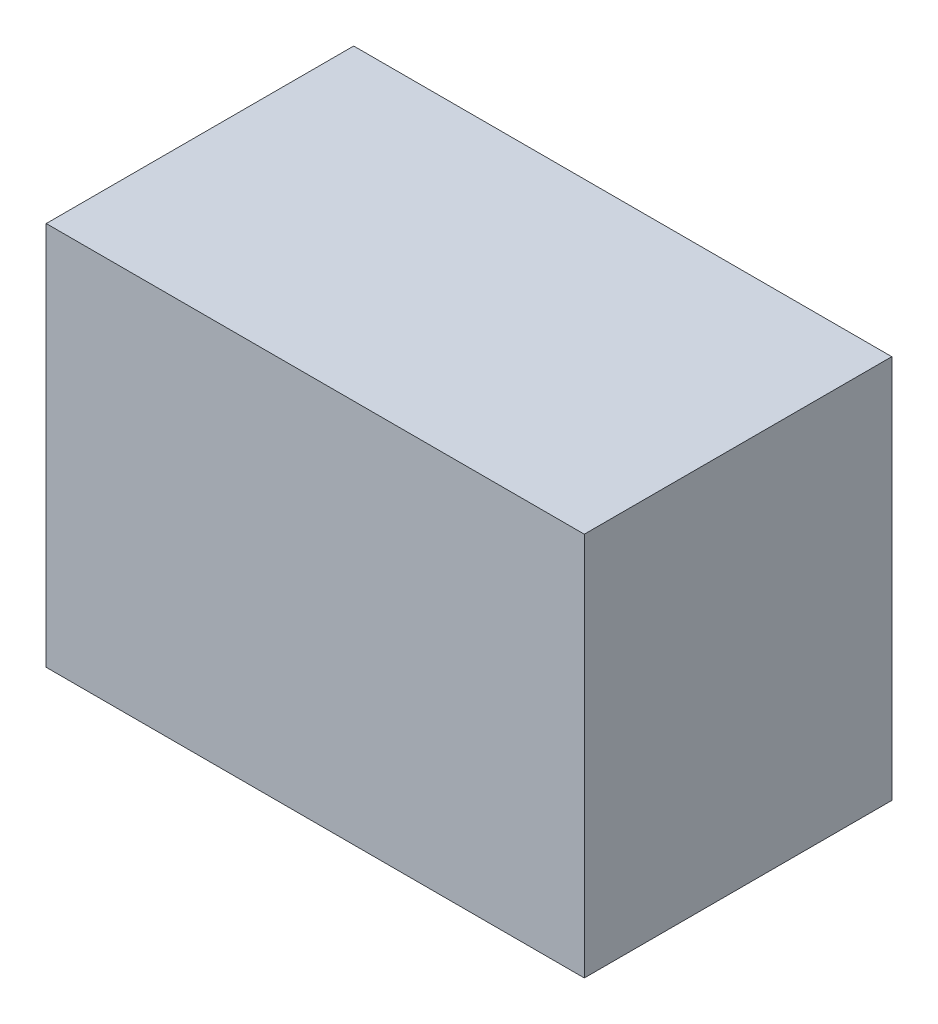
ISO-10303-21;
HEADER;
FILE_DESCRIPTION(('STEP AP214'),'2;1');
FILE_NAME('part.step','',(''),(''),'','','');
FILE_SCHEMA(('AUTOMOTIVE_DESIGN { 1 0 10303 214 1 1 1 1 }'));
ENDSEC;
DATA;
#1=APPLICATION_CONTEXT('core data for automotive mechanical design processes');
#2=APPLICATION_PROTOCOL_DEFINITION('international standard','automotive_design',2000,#1);
#3=PRODUCT_CONTEXT('',#1,'mechanical');
#4=PRODUCT('Part','Part','',(#3));
#5=PRODUCT_RELATED_PRODUCT_CATEGORY('part','',(#4));
#6=PRODUCT_DEFINITION_FORMATION('','',#4);
#7=PRODUCT_DEFINITION_CONTEXT('part definition',#1,'design');
#8=PRODUCT_DEFINITION('design','',#6,#7);
#9=PRODUCT_DEFINITION_SHAPE('','',#8);
#10=(LENGTH_UNIT() NAMED_UNIT(*) SI_UNIT(.MILLI.,.METRE.));
#11=(NAMED_UNIT(*) PLANE_ANGLE_UNIT() SI_UNIT($,.RADIAN.));
#12=(NAMED_UNIT(*) SI_UNIT($,.STERADIAN.) SOLID_ANGLE_UNIT());
#13=UNCERTAINTY_MEASURE_WITH_UNIT(LENGTH_MEASURE(1.E-05),#10,'distance_accuracy_value','');
#14=(GEOMETRIC_REPRESENTATION_CONTEXT(3) GLOBAL_UNCERTAINTY_ASSIGNED_CONTEXT((#13)) GLOBAL_UNIT_ASSIGNED_CONTEXT((#10,
#11,#12)) REPRESENTATION_CONTEXT('',''));
#15=CARTESIAN_POINT('',(0.,0.,0.));
#16=DIRECTION('',(0.,0.,1.));
#17=DIRECTION('',(1.,0.,0.));
#18=AXIS2_PLACEMENT_3D('',#15,#16,#17);
#19=CARTESIAN_POINT('',(-70.,50.,80.));
#20=DIRECTION('',(1.,0.,0.));
#21=DIRECTION('',(0.,0.,-1.));
#22=AXIS2_PLACEMENT_3D('',#19,#20,#21);
#23=PLANE('',#22);
#24=DIRECTION('',(0.,-1.,0.));
#25=VECTOR('',#24,1.);
#26=CARTESIAN_POINT('',(-70.,50.,0.));
#27=LINE('',#26,#25);
#28=CARTESIAN_POINT('',(-70.,50.,0.));
#29=VERTEX_POINT('',#28);
#30=CARTESIAN_POINT('',(-70.,-50.,0.));
#31=VERTEX_POINT('',#30);
#32=EDGE_CURVE('E82',#29,#31,#27,.T.);
#33=ORIENTED_EDGE('',*,*,#32,.T.);
#34=DIRECTION('',(0.,0.,-1.));
#35=VECTOR('',#34,1.);
#36=CARTESIAN_POINT('',(-70.,-50.,80.));
#37=LINE('',#36,#35);
#38=CARTESIAN_POINT('',(-70.,-50.,80.));
#39=VERTEX_POINT('',#38);
#40=EDGE_CURVE('E11',#39,#31,#37,.T.);
#41=ORIENTED_EDGE('',*,*,#40,.F.);
#42=DIRECTION('',(0.,-1.,0.));
#43=VECTOR('',#42,1.);
#44=CARTESIAN_POINT('',(-70.,50.,80.));
#45=LINE('',#44,#43);
#46=CARTESIAN_POINT('',(-70.,50.,80.));
#47=VERTEX_POINT('',#46);
#48=EDGE_CURVE('E68',#47,#39,#45,.T.);
#49=ORIENTED_EDGE('',*,*,#48,.F.);
#50=DIRECTION('',(0.,0.,-1.));
#51=VECTOR('',#50,1.);
#52=CARTESIAN_POINT('',(-70.,50.,80.));
#53=LINE('',#52,#51);
#54=EDGE_CURVE('E76',#47,#29,#53,.T.);
#55=ORIENTED_EDGE('',*,*,#54,.T.);
#56=EDGE_LOOP('',(#33,#41,#49,#55));
#57=FACE_BOUND('',#56,.T.);
#58=ADVANCED_FACE('F17',(#57),#23,.F.);
#59=CARTESIAN_POINT('',(-70.,-50.,80.));
#60=DIRECTION('',(0.,1.,0.));
#61=DIRECTION('',(0.,0.,1.));
#62=AXIS2_PLACEMENT_3D('',#59,#60,#61);
#63=PLANE('',#62);
#64=DIRECTION('',(1.,0.,0.));
#65=VECTOR('',#64,1.);
#66=CARTESIAN_POINT('',(-70.,-50.,0.));
#67=LINE('',#66,#65);
#68=CARTESIAN_POINT('',(70.,-50.,0.));
#69=VERTEX_POINT('',#68);
#70=EDGE_CURVE('E72',#31,#69,#67,.T.);
#71=ORIENTED_EDGE('',*,*,#70,.T.);
#72=DIRECTION('',(0.,0.,-1.));
#73=VECTOR('',#72,1.);
#74=CARTESIAN_POINT('',(70.,-50.,80.));
#75=LINE('',#74,#73);
#76=CARTESIAN_POINT('',(70.,-50.,80.));
#77=VERTEX_POINT('',#76);
#78=EDGE_CURVE('E25',#77,#69,#75,.T.);
#79=ORIENTED_EDGE('',*,*,#78,.F.);
#80=DIRECTION('',(1.,0.,0.));
#81=VECTOR('',#80,1.);
#82=CARTESIAN_POINT('',(-70.,-50.,80.));
#83=LINE('',#82,#81);
#84=EDGE_CURVE('E63',#39,#77,#83,.T.);
#85=ORIENTED_EDGE('',*,*,#84,.F.);
#86=ORIENTED_EDGE('',*,*,#40,.T.);
#87=EDGE_LOOP('',(#71,#79,#85,#86));
#88=FACE_BOUND('',#87,.T.);
#89=ADVANCED_FACE('F71',(#88),#63,.F.);
#90=CARTESIAN_POINT('',(70.,-50.,80.));
#91=DIRECTION('',(-1.,0.,0.));
#92=DIRECTION('',(0.,0.,1.));
#93=AXIS2_PLACEMENT_3D('',#90,#91,#92);
#94=PLANE('',#93);
#95=DIRECTION('',(0.,1.,0.));
#96=VECTOR('',#95,1.);
#97=CARTESIAN_POINT('',(70.,-50.,0.));
#98=LINE('',#97,#96);
#99=CARTESIAN_POINT('',(70.,50.,0.));
#100=VERTEX_POINT('',#99);
#101=EDGE_CURVE('E50',#69,#100,#98,.T.);
#102=ORIENTED_EDGE('',*,*,#101,.T.);
#103=DIRECTION('',(0.,0.,-1.));
#104=VECTOR('',#103,1.);
#105=CARTESIAN_POINT('',(70.,50.,80.));
#106=LINE('',#105,#104);
#107=CARTESIAN_POINT('',(70.,50.,80.));
#108=VERTEX_POINT('',#107);
#109=EDGE_CURVE('E73',#108,#100,#106,.T.);
#110=ORIENTED_EDGE('',*,*,#109,.F.);
#111=DIRECTION('',(0.,1.,0.));
#112=VECTOR('',#111,1.);
#113=CARTESIAN_POINT('',(70.,-50.,80.));
#114=LINE('',#113,#112);
#115=EDGE_CURVE('E66',#77,#108,#114,.T.);
#116=ORIENTED_EDGE('',*,*,#115,.F.);
#117=ORIENTED_EDGE('',*,*,#78,.T.);
#118=EDGE_LOOP('',(#102,#110,#116,#117));
#119=FACE_BOUND('',#118,.T.);
#120=ADVANCED_FACE('F74',(#119),#94,.F.);
#121=CARTESIAN_POINT('',(70.,50.,80.));
#122=DIRECTION('',(0.,-1.,0.));
#123=DIRECTION('',(0.,0.,-1.));
#124=AXIS2_PLACEMENT_3D('',#121,#122,#123);
#125=PLANE('',#124);
#126=DIRECTION('',(-1.,0.,0.));
#127=VECTOR('',#126,1.);
#128=CARTESIAN_POINT('',(70.,50.,0.));
#129=LINE('',#128,#127);
#130=EDGE_CURVE('E56',#100,#29,#129,.T.);
#131=ORIENTED_EDGE('',*,*,#130,.T.);
#132=ORIENTED_EDGE('',*,*,#54,.F.);
#133=DIRECTION('',(-1.,0.,0.));
#134=VECTOR('',#133,1.);
#135=CARTESIAN_POINT('',(70.,50.,80.));
#136=LINE('',#135,#134);
#137=EDGE_CURVE('E33',#108,#47,#136,.T.);
#138=ORIENTED_EDGE('',*,*,#137,.F.);
#139=ORIENTED_EDGE('',*,*,#109,.T.);
#140=EDGE_LOOP('',(#131,#132,#138,#139));
#141=FACE_BOUND('',#140,.T.);
#142=ADVANCED_FACE('F91',(#141),#125,.F.);
#143=CARTESIAN_POINT('',(-70.,-50.,80.));
#144=DIRECTION('',(0.,0.,1.));
#145=DIRECTION('',(1.,0.,0.));
#146=AXIS2_PLACEMENT_3D('',#143,#144,#145);
#147=PLANE('',#146);
#148=ORIENTED_EDGE('',*,*,#48,.T.);
#149=ORIENTED_EDGE('',*,*,#84,.T.);
#150=ORIENTED_EDGE('',*,*,#115,.T.);
#151=ORIENTED_EDGE('',*,*,#137,.T.);
#152=EDGE_LOOP('',(#148,#149,#150,#151));
#153=FACE_BOUND('',#152,.T.);
#154=ADVANCED_FACE('F64',(#153),#147,.T.);
#155=CARTESIAN_POINT('',(-70.,-50.,0.));
#156=DIRECTION('',(0.,0.,1.));
#157=DIRECTION('',(1.,0.,0.));
#158=AXIS2_PLACEMENT_3D('',#155,#156,#157);
#159=PLANE('',#158);
#160=ORIENTED_EDGE('',*,*,#32,.F.);
#161=ORIENTED_EDGE('',*,*,#130,.F.);
#162=ORIENTED_EDGE('',*,*,#101,.F.);
#163=ORIENTED_EDGE('',*,*,#70,.F.);
#164=EDGE_LOOP('',(#160,#161,#162,#163));
#165=FACE_BOUND('',#164,.T.);
#166=ADVANCED_FACE('F94',(#165),#159,.F.);
#167=CLOSED_SHELL('',(#58,#89,#120,#142,#154,#166));
#168=MANIFOLD_SOLID_BREP('B1',#167);
#169=ADVANCED_BREP_SHAPE_REPRESENTATION('',(#18,#168),#14);
#170=SHAPE_DEFINITION_REPRESENTATION(#9,#169);
ENDSEC;
END-ISO-10303-21;
